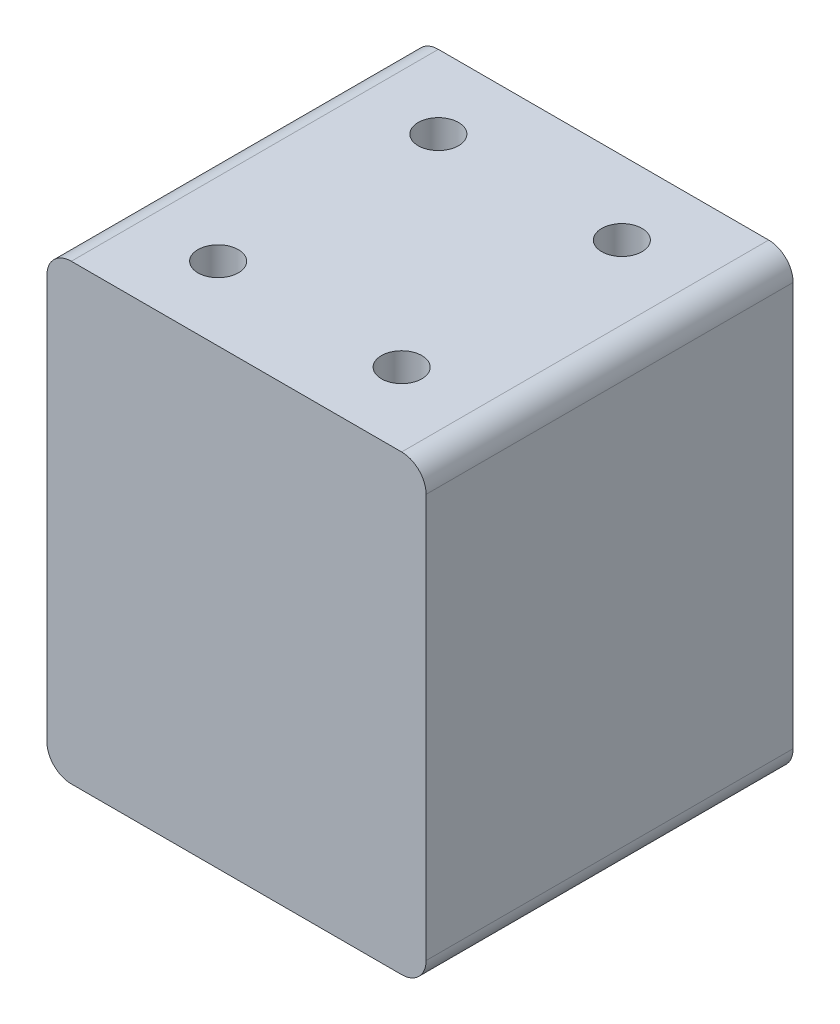
ISO-10303-21;
HEADER;
FILE_DESCRIPTION(('STEP AP214'),'2;1');
FILE_NAME('part.step','',(''),(''),'','','');
FILE_SCHEMA(('AUTOMOTIVE_DESIGN { 1 0 10303 214 1 1 1 1 }'));
ENDSEC;
DATA;
#1=APPLICATION_CONTEXT('core data for automotive mechanical design processes');
#2=APPLICATION_PROTOCOL_DEFINITION('international standard','automotive_design',2000,#1);
#3=PRODUCT_CONTEXT('',#1,'mechanical');
#4=PRODUCT('Part','Part','',(#3));
#5=PRODUCT_RELATED_PRODUCT_CATEGORY('part','',(#4));
#6=PRODUCT_DEFINITION_FORMATION('','',#4);
#7=PRODUCT_DEFINITION_CONTEXT('part definition',#1,'design');
#8=PRODUCT_DEFINITION('design','',#6,#7);
#9=PRODUCT_DEFINITION_SHAPE('','',#8);
#10=(LENGTH_UNIT() NAMED_UNIT(*) SI_UNIT(.MILLI.,.METRE.));
#11=(NAMED_UNIT(*) PLANE_ANGLE_UNIT() SI_UNIT($,.RADIAN.));
#12=(NAMED_UNIT(*) SI_UNIT($,.STERADIAN.) SOLID_ANGLE_UNIT());
#13=UNCERTAINTY_MEASURE_WITH_UNIT(LENGTH_MEASURE(1.E-05),#10,'distance_accuracy_value','');
#14=(GEOMETRIC_REPRESENTATION_CONTEXT(3) GLOBAL_UNCERTAINTY_ASSIGNED_CONTEXT((#13)) GLOBAL_UNIT_ASSIGNED_CONTEXT((#10,
#11,#12)) REPRESENTATION_CONTEXT('',''));
#15=CARTESIAN_POINT('',(0.,0.,0.));
#16=DIRECTION('',(0.,0.,1.));
#17=DIRECTION('',(1.,0.,0.));
#18=AXIS2_PLACEMENT_3D('',#15,#16,#17);
#19=CARTESIAN_POINT('',(15.5,18.5,30.));
#20=DIRECTION('',(-1.,0.,0.));
#21=DIRECTION('',(0.,-1.,0.));
#22=AXIS2_PLACEMENT_3D('',#19,#20,#21);
#23=PLANE('',#22);
#24=DIRECTION('',(0.,1.,0.));
#25=VECTOR('',#24,1.);
#26=CARTESIAN_POINT('',(15.5,18.5,30.));
#27=LINE('',#26,#25);
#28=CARTESIAN_POINT('',(15.5,-16.5,30.));
#29=VERTEX_POINT('',#28);
#30=CARTESIAN_POINT('',(15.5,16.5,30.));
#31=VERTEX_POINT('',#30);
#32=EDGE_CURVE('E231',#29,#31,#27,.T.);
#33=ORIENTED_EDGE('',*,*,#32,.F.);
#34=DIRECTION('',(0.,0.,-1.));
#35=VECTOR('',#34,1.);
#36=CARTESIAN_POINT('',(15.5,-16.5,30.));
#37=LINE('',#36,#35);
#38=CARTESIAN_POINT('',(15.5,-16.5,0.));
#39=VERTEX_POINT('',#38);
#40=EDGE_CURVE('E253',#29,#39,#37,.T.);
#41=ORIENTED_EDGE('',*,*,#40,.T.);
#42=DIRECTION('',(0.,1.,0.));
#43=VECTOR('',#42,1.);
#44=CARTESIAN_POINT('',(15.5,18.5,0.));
#45=LINE('',#44,#43);
#46=CARTESIAN_POINT('',(15.5,16.5,0.));
#47=VERTEX_POINT('',#46);
#48=EDGE_CURVE('E230',#39,#47,#45,.T.);
#49=ORIENTED_EDGE('',*,*,#48,.T.);
#50=DIRECTION('',(0.,0.,-1.));
#51=VECTOR('',#50,1.);
#52=CARTESIAN_POINT('',(15.5,16.5,30.));
#53=LINE('',#52,#51);
#54=EDGE_CURVE('E242',#47,#31,#53,.F.);
#55=ORIENTED_EDGE('',*,*,#54,.T.);
#56=EDGE_LOOP('',(#33,#41,#49,#55));
#57=FACE_BOUND('',#56,.T.);
#58=ADVANCED_FACE('F45',(#57),#23,.F.);
#59=CARTESIAN_POINT('',(-15.5,18.5,30.));
#60=DIRECTION('',(0.,-1.,0.));
#61=DIRECTION('',(0.,0.,-1.));
#62=AXIS2_PLACEMENT_3D('',#59,#60,#61);
#63=PLANE('',#62);
#64=CARTESIAN_POINT('',(-7.50000000000001,18.5,6.));
#65=DIRECTION('',(0.,1.,0.));
#66=DIRECTION('',(0.,0.,1.));
#67=AXIS2_PLACEMENT_3D('',#64,#65,#66);
#68=CIRCLE('',#67,1.65);
#69=CARTESIAN_POINT('',(-7.50000000000001,18.5,7.65));
#70=VERTEX_POINT('',#69);
#71=EDGE_CURVE('E206',#70,#70,#68,.T.);
#72=ORIENTED_EDGE('',*,*,#71,.F.);
#73=EDGE_LOOP('',(#72));
#74=FACE_BOUND('',#73,.T.);
#75=CARTESIAN_POINT('',(7.49999999999999,18.5,6.));
#76=DIRECTION('',(0.,1.,0.));
#77=DIRECTION('',(0.,0.,1.));
#78=AXIS2_PLACEMENT_3D('',#75,#76,#77);
#79=CIRCLE('',#78,1.65);
#80=CARTESIAN_POINT('',(7.49999999999999,18.5,7.65));
#81=VERTEX_POINT('',#80);
#82=EDGE_CURVE('E212',#81,#81,#79,.T.);
#83=ORIENTED_EDGE('',*,*,#82,.F.);
#84=EDGE_LOOP('',(#83));
#85=FACE_BOUND('',#84,.T.);
#86=CARTESIAN_POINT('',(7.5,18.5,24.));
#87=DIRECTION('',(0.,1.,0.));
#88=DIRECTION('',(0.,0.,1.));
#89=AXIS2_PLACEMENT_3D('',#86,#87,#88);
#90=CIRCLE('',#89,1.65);
#91=CARTESIAN_POINT('',(7.5,18.5,25.65));
#92=VERTEX_POINT('',#91);
#93=EDGE_CURVE('E218',#92,#92,#90,.T.);
#94=ORIENTED_EDGE('',*,*,#93,.F.);
#95=EDGE_LOOP('',(#94));
#96=FACE_BOUND('',#95,.T.);
#97=CARTESIAN_POINT('',(-7.5,18.5,24.));
#98=DIRECTION('',(0.,1.,0.));
#99=DIRECTION('',(0.,0.,1.));
#100=AXIS2_PLACEMENT_3D('',#97,#98,#99);
#101=CIRCLE('',#100,1.65);
#102=CARTESIAN_POINT('',(-7.5,18.5,25.65));
#103=VERTEX_POINT('',#102);
#104=EDGE_CURVE('E224',#103,#103,#101,.T.);
#105=ORIENTED_EDGE('',*,*,#104,.F.);
#106=EDGE_LOOP('',(#105));
#107=FACE_BOUND('',#106,.T.);
#108=DIRECTION('',(-1.,0.,0.));
#109=VECTOR('',#108,1.);
#110=CARTESIAN_POINT('',(-15.5,18.5,0.));
#111=LINE('',#110,#109);
#112=CARTESIAN_POINT('',(13.5,18.5,0.));
#113=VERTEX_POINT('',#112);
#114=CARTESIAN_POINT('',(-13.5,18.5,0.));
#115=VERTEX_POINT('',#114);
#116=EDGE_CURVE('E245',#113,#115,#111,.T.);
#117=ORIENTED_EDGE('',*,*,#116,.T.);
#118=DIRECTION('',(0.,0.,-1.));
#119=VECTOR('',#118,1.);
#120=CARTESIAN_POINT('',(-13.5,18.5,30.));
#121=LINE('',#120,#119);
#122=CARTESIAN_POINT('',(-13.5,18.5,30.));
#123=VERTEX_POINT('',#122);
#124=EDGE_CURVE('E283',#115,#123,#121,.F.);
#125=ORIENTED_EDGE('',*,*,#124,.T.);
#126=DIRECTION('',(-1.,0.,0.));
#127=VECTOR('',#126,1.);
#128=CARTESIAN_POINT('',(-15.5,18.5,30.));
#129=LINE('',#128,#127);
#130=CARTESIAN_POINT('',(13.5,18.5,30.));
#131=VERTEX_POINT('',#130);
#132=EDGE_CURVE('E234',#131,#123,#129,.T.);
#133=ORIENTED_EDGE('',*,*,#132,.F.);
#134=DIRECTION('',(0.,0.,-1.));
#135=VECTOR('',#134,1.);
#136=CARTESIAN_POINT('',(13.5,18.5,30.));
#137=LINE('',#136,#135);
#138=EDGE_CURVE('E280',#131,#113,#137,.T.);
#139=ORIENTED_EDGE('',*,*,#138,.T.);
#140=EDGE_LOOP('',(#117,#125,#133,#139));
#141=FACE_BOUND('',#140,.T.);
#142=ADVANCED_FACE('F300',(#74,#85,#96,#107,#141),#63,.F.);
#143=CARTESIAN_POINT('',(-15.5,18.5,30.));
#144=DIRECTION('',(1.,0.,0.));
#145=DIRECTION('',(0.,1.,0.));
#146=AXIS2_PLACEMENT_3D('',#143,#144,#145);
#147=PLANE('',#146);
#148=CARTESIAN_POINT('',(-15.5,12.5,11.));
#149=DIRECTION('',(-1.,0.,0.));
#150=DIRECTION('',(0.,0.,1.));
#151=AXIS2_PLACEMENT_3D('',#148,#149,#150);
#152=CIRCLE('',#151,1.65);
#153=CARTESIAN_POINT('',(-15.5,12.5,12.65));
#154=VERTEX_POINT('',#153);
#155=EDGE_CURVE('E158',#154,#154,#152,.T.);
#156=ORIENTED_EDGE('',*,*,#155,.F.);
#157=EDGE_LOOP('',(#156));
#158=FACE_BOUND('',#157,.T.);
#159=CARTESIAN_POINT('',(-15.5,12.5,19.));
#160=DIRECTION('',(-1.,0.,0.));
#161=DIRECTION('',(0.,0.,1.));
#162=AXIS2_PLACEMENT_3D('',#159,#160,#161);
#163=CIRCLE('',#162,1.65);
#164=CARTESIAN_POINT('',(-15.5,12.5,20.65));
#165=VERTEX_POINT('',#164);
#166=EDGE_CURVE('E157',#165,#165,#163,.T.);
#167=ORIENTED_EDGE('',*,*,#166,.F.);
#168=EDGE_LOOP('',(#167));
#169=FACE_BOUND('',#168,.T.);
#170=CARTESIAN_POINT('',(-15.5,-12.5,19.));
#171=DIRECTION('',(-1.,0.,0.));
#172=DIRECTION('',(0.,0.,1.));
#173=AXIS2_PLACEMENT_3D('',#170,#171,#172);
#174=CIRCLE('',#173,1.65);
#175=CARTESIAN_POINT('',(-15.5,-12.5,20.65));
#176=VERTEX_POINT('',#175);
#177=EDGE_CURVE('E170',#176,#176,#174,.T.);
#178=ORIENTED_EDGE('',*,*,#177,.F.);
#179=EDGE_LOOP('',(#178));
#180=FACE_BOUND('',#179,.T.);
#181=CARTESIAN_POINT('',(-15.5,-12.5,11.));
#182=DIRECTION('',(-1.,0.,0.));
#183=DIRECTION('',(0.,0.,1.));
#184=AXIS2_PLACEMENT_3D('',#181,#182,#183);
#185=CIRCLE('',#184,1.65);
#186=CARTESIAN_POINT('',(-15.5,-12.5,12.65));
#187=VERTEX_POINT('',#186);
#188=EDGE_CURVE('E176',#187,#187,#185,.T.);
#189=ORIENTED_EDGE('',*,*,#188,.F.);
#190=EDGE_LOOP('',(#189));
#191=FACE_BOUND('',#190,.T.);
#192=DIRECTION('',(0.,-1.,0.));
#193=VECTOR('',#192,1.);
#194=CARTESIAN_POINT('',(-15.5,18.5,0.));
#195=LINE('',#194,#193);
#196=CARTESIAN_POINT('',(-15.5,16.5,0.));
#197=VERTEX_POINT('',#196);
#198=CARTESIAN_POINT('',(-15.5,-16.5,0.));
#199=VERTEX_POINT('',#198);
#200=EDGE_CURVE('E248',#197,#199,#195,.T.);
#201=ORIENTED_EDGE('',*,*,#200,.T.);
#202=DIRECTION('',(0.,0.,-1.));
#203=VECTOR('',#202,1.);
#204=CARTESIAN_POINT('',(-15.5,-16.5,30.));
#205=LINE('',#204,#203);
#206=CARTESIAN_POINT('',(-15.5,-16.5,30.));
#207=VERTEX_POINT('',#206);
#208=EDGE_CURVE('E61',#199,#207,#205,.F.);
#209=ORIENTED_EDGE('',*,*,#208,.T.);
#210=DIRECTION('',(0.,-1.,0.));
#211=VECTOR('',#210,1.);
#212=CARTESIAN_POINT('',(-15.5,18.5,30.));
#213=LINE('',#212,#211);
#214=CARTESIAN_POINT('',(-15.5,16.5,30.));
#215=VERTEX_POINT('',#214);
#216=EDGE_CURVE('E237',#215,#207,#213,.T.);
#217=ORIENTED_EDGE('',*,*,#216,.F.);
#218=DIRECTION('',(0.,0.,-1.));
#219=VECTOR('',#218,1.);
#220=CARTESIAN_POINT('',(-15.5,16.5,30.));
#221=LINE('',#220,#219);
#222=EDGE_CURVE('E276',#215,#197,#221,.T.);
#223=ORIENTED_EDGE('',*,*,#222,.T.);
#224=EDGE_LOOP('',(#201,#209,#217,#223));
#225=FACE_BOUND('',#224,.T.);
#226=ADVANCED_FACE('F306',(#158,#169,#180,#191,#225),#147,.F.);
#227=CARTESIAN_POINT('',(-15.5,-18.5,30.));
#228=DIRECTION('',(0.,1.,0.));
#229=DIRECTION('',(0.,0.,1.));
#230=AXIS2_PLACEMENT_3D('',#227,#228,#229);
#231=PLANE('',#230);
#232=CARTESIAN_POINT('',(-7.50000000000001,-18.5,6.));
#233=DIRECTION('',(0.,-1.,0.));
#234=DIRECTION('',(0.,0.,-1.));
#235=AXIS2_PLACEMENT_3D('',#232,#233,#234);
#236=CIRCLE('',#235,1.65);
#237=CARTESIAN_POINT('',(-7.50000000000001,-18.5,4.35));
#238=VERTEX_POINT('',#237);
#239=EDGE_CURVE('E182',#238,#238,#236,.T.);
#240=ORIENTED_EDGE('',*,*,#239,.F.);
#241=EDGE_LOOP('',(#240));
#242=FACE_BOUND('',#241,.T.);
#243=CARTESIAN_POINT('',(7.49999999999999,-18.5,6.));
#244=DIRECTION('',(0.,-1.,0.));
#245=DIRECTION('',(0.,0.,-1.));
#246=AXIS2_PLACEMENT_3D('',#243,#244,#245);
#247=CIRCLE('',#246,1.65);
#248=CARTESIAN_POINT('',(7.49999999999999,-18.5,4.35));
#249=VERTEX_POINT('',#248);
#250=EDGE_CURVE('E188',#249,#249,#247,.T.);
#251=ORIENTED_EDGE('',*,*,#250,.F.);
#252=EDGE_LOOP('',(#251));
#253=FACE_BOUND('',#252,.T.);
#254=CARTESIAN_POINT('',(7.5,-18.5,24.));
#255=DIRECTION('',(0.,-1.,0.));
#256=DIRECTION('',(0.,0.,-1.));
#257=AXIS2_PLACEMENT_3D('',#254,#255,#256);
#258=CIRCLE('',#257,1.65);
#259=CARTESIAN_POINT('',(7.5,-18.5,22.35));
#260=VERTEX_POINT('',#259);
#261=EDGE_CURVE('E194',#260,#260,#258,.T.);
#262=ORIENTED_EDGE('',*,*,#261,.F.);
#263=EDGE_LOOP('',(#262));
#264=FACE_BOUND('',#263,.T.);
#265=CARTESIAN_POINT('',(-7.5,-18.5,24.));
#266=DIRECTION('',(0.,-1.,0.));
#267=DIRECTION('',(0.,0.,-1.));
#268=AXIS2_PLACEMENT_3D('',#265,#266,#267);
#269=CIRCLE('',#268,1.65);
#270=CARTESIAN_POINT('',(-7.5,-18.5,22.35));
#271=VERTEX_POINT('',#270);
#272=EDGE_CURVE('E200',#271,#271,#269,.T.);
#273=ORIENTED_EDGE('',*,*,#272,.F.);
#274=EDGE_LOOP('',(#273));
#275=FACE_BOUND('',#274,.T.);
#276=DIRECTION('',(1.,0.,0.));
#277=VECTOR('',#276,1.);
#278=CARTESIAN_POINT('',(-15.5,-18.5,0.));
#279=LINE('',#278,#277);
#280=CARTESIAN_POINT('',(-13.5,-18.5,0.));
#281=VERTEX_POINT('',#280);
#282=CARTESIAN_POINT('',(13.5,-18.5,0.));
#283=VERTEX_POINT('',#282);
#284=EDGE_CURVE('E235',#281,#283,#279,.T.);
#285=ORIENTED_EDGE('',*,*,#284,.T.);
#286=DIRECTION('',(0.,0.,-1.));
#287=VECTOR('',#286,1.);
#288=CARTESIAN_POINT('',(13.5,-18.5,30.));
#289=LINE('',#288,#287);
#290=CARTESIAN_POINT('',(13.5,-18.5,30.));
#291=VERTEX_POINT('',#290);
#292=EDGE_CURVE('E267',#283,#291,#289,.F.);
#293=ORIENTED_EDGE('',*,*,#292,.T.);
#294=DIRECTION('',(1.,0.,0.));
#295=VECTOR('',#294,1.);
#296=CARTESIAN_POINT('',(-15.5,-18.5,30.));
#297=LINE('',#296,#295);
#298=CARTESIAN_POINT('',(-13.5,-18.5,30.));
#299=VERTEX_POINT('',#298);
#300=EDGE_CURVE('E239',#299,#291,#297,.T.);
#301=ORIENTED_EDGE('',*,*,#300,.F.);
#302=DIRECTION('',(0.,0.,-1.));
#303=VECTOR('',#302,1.);
#304=CARTESIAN_POINT('',(-13.5,-18.5,30.));
#305=LINE('',#304,#303);
#306=EDGE_CURVE('E264',#299,#281,#305,.T.);
#307=ORIENTED_EDGE('',*,*,#306,.T.);
#308=EDGE_LOOP('',(#285,#293,#301,#307));
#309=FACE_BOUND('',#308,.T.);
#310=ADVANCED_FACE('F337',(#242,#253,#264,#275,#309),#231,.F.);
#311=CARTESIAN_POINT('',(0.,0.,30.));
#312=DIRECTION('',(0.,0.,1.));
#313=DIRECTION('',(1.,0.,0.));
#314=AXIS2_PLACEMENT_3D('',#311,#312,#313);
#315=PLANE('',#314);
#316=ORIENTED_EDGE('',*,*,#300,.T.);
#317=CARTESIAN_POINT('',(13.5,-16.5,30.));
#318=DIRECTION('',(0.,0.,1.));
#319=DIRECTION('',(1.,0.,0.));
#320=AXIS2_PLACEMENT_3D('',#317,#318,#319);
#321=CIRCLE('',#320,2.);
#322=EDGE_CURVE('E274',#291,#29,#321,.T.);
#323=ORIENTED_EDGE('',*,*,#322,.T.);
#324=ORIENTED_EDGE('',*,*,#32,.T.);
#325=CARTESIAN_POINT('',(13.5,16.5,30.));
#326=DIRECTION('',(0.,0.,1.));
#327=DIRECTION('',(1.,0.,0.));
#328=AXIS2_PLACEMENT_3D('',#325,#326,#327);
#329=CIRCLE('',#328,2.);
#330=EDGE_CURVE('E269',#31,#131,#329,.T.);
#331=ORIENTED_EDGE('',*,*,#330,.T.);
#332=ORIENTED_EDGE('',*,*,#132,.T.);
#333=CARTESIAN_POINT('',(-13.5,16.5,30.));
#334=DIRECTION('',(0.,0.,1.));
#335=DIRECTION('',(1.,0.,0.));
#336=AXIS2_PLACEMENT_3D('',#333,#334,#335);
#337=CIRCLE('',#336,2.);
#338=EDGE_CURVE('E68',#123,#215,#337,.T.);
#339=ORIENTED_EDGE('',*,*,#338,.T.);
#340=ORIENTED_EDGE('',*,*,#216,.T.);
#341=CARTESIAN_POINT('',(-13.5,-16.5,30.));
#342=DIRECTION('',(0.,0.,1.));
#343=DIRECTION('',(1.,0.,0.));
#344=AXIS2_PLACEMENT_3D('',#341,#342,#343);
#345=CIRCLE('',#344,2.);
#346=EDGE_CURVE('E272',#207,#299,#345,.T.);
#347=ORIENTED_EDGE('',*,*,#346,.T.);
#348=EDGE_LOOP('',(#316,#323,#324,#331,#332,#339,#340,#347));
#349=FACE_BOUND('',#348,.T.);
#350=ADVANCED_FACE('F340',(#349),#315,.T.);
#351=CARTESIAN_POINT('',(0.,0.,0.));
#352=DIRECTION('',(0.,0.,1.));
#353=DIRECTION('',(1.,0.,0.));
#354=AXIS2_PLACEMENT_3D('',#351,#352,#353);
#355=PLANE('',#354);
#356=CARTESIAN_POINT('',(0.,0.,0.));
#357=DIRECTION('',(0.,0.,1.));
#358=DIRECTION('',(1.,0.,0.));
#359=AXIS2_PLACEMENT_3D('',#356,#357,#358);
#360=CIRCLE('',#359,10.5);
#361=CARTESIAN_POINT('',(10.5,0.,0.));
#362=VERTEX_POINT('',#361);
#363=EDGE_CURVE('E11',#362,#362,#360,.T.);
#364=ORIENTED_EDGE('',*,*,#363,.T.);
#365=EDGE_LOOP('',(#364));
#366=FACE_BOUND('',#365,.T.);
#367=ORIENTED_EDGE('',*,*,#48,.F.);
#368=CARTESIAN_POINT('',(13.5,-16.5,0.));
#369=DIRECTION('',(0.,0.,1.));
#370=DIRECTION('',(1.,0.,0.));
#371=AXIS2_PLACEMENT_3D('',#368,#369,#370);
#372=CIRCLE('',#371,2.);
#373=EDGE_CURVE('E262',#39,#283,#372,.F.);
#374=ORIENTED_EDGE('',*,*,#373,.T.);
#375=ORIENTED_EDGE('',*,*,#284,.F.);
#376=CARTESIAN_POINT('',(-13.5,-16.5,0.));
#377=DIRECTION('',(0.,0.,1.));
#378=DIRECTION('',(1.,0.,0.));
#379=AXIS2_PLACEMENT_3D('',#376,#377,#378);
#380=CIRCLE('',#379,2.);
#381=EDGE_CURVE('E260',#281,#199,#380,.F.);
#382=ORIENTED_EDGE('',*,*,#381,.T.);
#383=ORIENTED_EDGE('',*,*,#200,.F.);
#384=CARTESIAN_POINT('',(-13.5,16.5,0.));
#385=DIRECTION('',(0.,0.,1.));
#386=DIRECTION('',(1.,0.,0.));
#387=AXIS2_PLACEMENT_3D('',#384,#385,#386);
#388=CIRCLE('',#387,2.);
#389=EDGE_CURVE('E258',#197,#115,#388,.F.);
#390=ORIENTED_EDGE('',*,*,#389,.T.);
#391=ORIENTED_EDGE('',*,*,#116,.F.);
#392=CARTESIAN_POINT('',(13.5,16.5,0.));
#393=DIRECTION('',(0.,0.,1.));
#394=DIRECTION('',(1.,0.,0.));
#395=AXIS2_PLACEMENT_3D('',#392,#393,#394);
#396=CIRCLE('',#395,2.);
#397=EDGE_CURVE('E256',#113,#47,#396,.F.);
#398=ORIENTED_EDGE('',*,*,#397,.T.);
#399=EDGE_LOOP('',(#367,#374,#375,#382,#383,#390,#391,#398));
#400=FACE_BOUND('',#399,.T.);
#401=ADVANCED_FACE('F330',(#366,#400),#355,.F.);
#402=CARTESIAN_POINT('',(-7.5,9.5,24.));
#403=DIRECTION('',(0.,1.,0.));
#404=DIRECTION('',(0.,0.,1.));
#405=AXIS2_PLACEMENT_3D('',#402,#403,#404);
#406=CONICAL_SURFACE('',#405,1.65,1.02974425867665);
#407=CARTESIAN_POINT('',(-7.50000000000001,8.50857997860452,24.));
#408=VERTEX_POINT('',#407);
#409=VERTEX_LOOP('',#408);
#410=FACE_BOUND('',#409,.T.);
#411=CARTESIAN_POINT('',(-7.5,9.5,24.));
#412=DIRECTION('',(0.,1.,0.));
#413=DIRECTION('',(0.,0.,1.));
#414=AXIS2_PLACEMENT_3D('',#411,#412,#413);
#415=CIRCLE('',#414,1.65);
#416=CARTESIAN_POINT('',(-7.5,9.5,25.65));
#417=VERTEX_POINT('',#416);
#418=EDGE_CURVE('E227',#417,#417,#415,.T.);
#419=ORIENTED_EDGE('',*,*,#418,.T.);
#420=EDGE_LOOP('',(#419));
#421=FACE_BOUND('',#420,.T.);
#422=ADVANCED_FACE('F353',(#410,#421),#406,.F.);
#423=CARTESIAN_POINT('',(-7.5,18.5,24.));
#424=DIRECTION('',(0.,1.,0.));
#425=DIRECTION('',(0.,0.,1.));
#426=AXIS2_PLACEMENT_3D('',#423,#424,#425);
#427=CYLINDRICAL_SURFACE('',#426,1.65);
#428=ORIENTED_EDGE('',*,*,#418,.F.);
#429=EDGE_LOOP('',(#428));
#430=FACE_BOUND('',#429,.T.);
#431=ORIENTED_EDGE('',*,*,#104,.T.);
#432=EDGE_LOOP('',(#431));
#433=FACE_BOUND('',#432,.T.);
#434=ADVANCED_FACE('F444',(#430,#433),#427,.F.);
#435=CARTESIAN_POINT('',(7.5,9.5,24.));
#436=DIRECTION('',(0.,1.,0.));
#437=DIRECTION('',(0.,0.,1.));
#438=AXIS2_PLACEMENT_3D('',#435,#436,#437);
#439=CONICAL_SURFACE('',#438,1.65,1.02974425867665);
#440=CARTESIAN_POINT('',(7.49999999999999,8.50857997860452,24.));
#441=VERTEX_POINT('',#440);
#442=VERTEX_LOOP('',#441);
#443=FACE_BOUND('',#442,.T.);
#444=CARTESIAN_POINT('',(7.5,9.5,24.));
#445=DIRECTION('',(0.,1.,0.));
#446=DIRECTION('',(0.,0.,1.));
#447=AXIS2_PLACEMENT_3D('',#444,#445,#446);
#448=CIRCLE('',#447,1.65);
#449=CARTESIAN_POINT('',(7.5,9.5,25.65));
#450=VERTEX_POINT('',#449);
#451=EDGE_CURVE('E221',#450,#450,#448,.T.);
#452=ORIENTED_EDGE('',*,*,#451,.T.);
#453=EDGE_LOOP('',(#452));
#454=FACE_BOUND('',#453,.T.);
#455=ADVANCED_FACE('F441',(#443,#454),#439,.F.);
#456=CARTESIAN_POINT('',(7.5,18.5,24.));
#457=DIRECTION('',(0.,1.,0.));
#458=DIRECTION('',(0.,0.,1.));
#459=AXIS2_PLACEMENT_3D('',#456,#457,#458);
#460=CYLINDRICAL_SURFACE('',#459,1.65);
#461=ORIENTED_EDGE('',*,*,#451,.F.);
#462=EDGE_LOOP('',(#461));
#463=FACE_BOUND('',#462,.T.);
#464=ORIENTED_EDGE('',*,*,#93,.T.);
#465=EDGE_LOOP('',(#464));
#466=FACE_BOUND('',#465,.T.);
#467=ADVANCED_FACE('F437',(#463,#466),#460,.F.);
#468=CARTESIAN_POINT('',(7.49999999999999,9.5,6.));
#469=DIRECTION('',(0.,1.,0.));
#470=DIRECTION('',(0.,0.,1.));
#471=AXIS2_PLACEMENT_3D('',#468,#469,#470);
#472=CONICAL_SURFACE('',#471,1.65,1.02974425867665);
#473=CARTESIAN_POINT('',(7.49999999999999,8.50857997860452,6.));
#474=VERTEX_POINT('',#473);
#475=VERTEX_LOOP('',#474);
#476=FACE_BOUND('',#475,.T.);
#477=CARTESIAN_POINT('',(7.49999999999999,9.5,6.));
#478=DIRECTION('',(0.,1.,0.));
#479=DIRECTION('',(0.,0.,1.));
#480=AXIS2_PLACEMENT_3D('',#477,#478,#479);
#481=CIRCLE('',#480,1.65);
#482=CARTESIAN_POINT('',(7.49999999999999,9.5,7.65));
#483=VERTEX_POINT('',#482);
#484=EDGE_CURVE('E215',#483,#483,#481,.T.);
#485=ORIENTED_EDGE('',*,*,#484,.T.);
#486=EDGE_LOOP('',(#485));
#487=FACE_BOUND('',#486,.T.);
#488=ADVANCED_FACE('F433',(#476,#487),#472,.F.);
#489=CARTESIAN_POINT('',(7.49999999999999,18.5,6.));
#490=DIRECTION('',(0.,1.,0.));
#491=DIRECTION('',(0.,0.,1.));
#492=AXIS2_PLACEMENT_3D('',#489,#490,#491);
#493=CYLINDRICAL_SURFACE('',#492,1.65);
#494=ORIENTED_EDGE('',*,*,#484,.F.);
#495=EDGE_LOOP('',(#494));
#496=FACE_BOUND('',#495,.T.);
#497=ORIENTED_EDGE('',*,*,#82,.T.);
#498=EDGE_LOOP('',(#497));
#499=FACE_BOUND('',#498,.T.);
#500=ADVANCED_FACE('F429',(#496,#499),#493,.F.);
#501=CARTESIAN_POINT('',(-7.50000000000001,9.5,6.));
#502=DIRECTION('',(0.,1.,0.));
#503=DIRECTION('',(0.,0.,1.));
#504=AXIS2_PLACEMENT_3D('',#501,#502,#503);
#505=CONICAL_SURFACE('',#504,1.65,1.02974425867665);
#506=CARTESIAN_POINT('',(-7.50000000000001,8.50857997860452,6.));
#507=VERTEX_POINT('',#506);
#508=VERTEX_LOOP('',#507);
#509=FACE_BOUND('',#508,.T.);
#510=CARTESIAN_POINT('',(-7.50000000000001,9.5,6.));
#511=DIRECTION('',(0.,1.,0.));
#512=DIRECTION('',(0.,0.,1.));
#513=AXIS2_PLACEMENT_3D('',#510,#511,#512);
#514=CIRCLE('',#513,1.65);
#515=CARTESIAN_POINT('',(-7.50000000000001,9.5,7.65));
#516=VERTEX_POINT('',#515);
#517=EDGE_CURVE('E209',#516,#516,#514,.T.);
#518=ORIENTED_EDGE('',*,*,#517,.T.);
#519=EDGE_LOOP('',(#518));
#520=FACE_BOUND('',#519,.T.);
#521=ADVANCED_FACE('F425',(#509,#520),#505,.F.);
#522=CARTESIAN_POINT('',(-7.50000000000001,18.5,6.));
#523=DIRECTION('',(0.,1.,0.));
#524=DIRECTION('',(0.,0.,1.));
#525=AXIS2_PLACEMENT_3D('',#522,#523,#524);
#526=CYLINDRICAL_SURFACE('',#525,1.65);
#527=ORIENTED_EDGE('',*,*,#517,.F.);
#528=EDGE_LOOP('',(#527));
#529=FACE_BOUND('',#528,.T.);
#530=ORIENTED_EDGE('',*,*,#71,.T.);
#531=EDGE_LOOP('',(#530));
#532=FACE_BOUND('',#531,.T.);
#533=ADVANCED_FACE('F421',(#529,#532),#526,.F.);
#534=CARTESIAN_POINT('',(-7.5,-9.5,24.));
#535=DIRECTION('',(0.,-1.,0.));
#536=DIRECTION('',(0.,0.,-1.));
#537=AXIS2_PLACEMENT_3D('',#534,#535,#536);
#538=CONICAL_SURFACE('',#537,1.65,1.02974425867665);
#539=CARTESIAN_POINT('',(-7.50000000000001,-8.50857997860452,24.));
#540=VERTEX_POINT('',#539);
#541=VERTEX_LOOP('',#540);
#542=FACE_BOUND('',#541,.T.);
#543=CARTESIAN_POINT('',(-7.5,-9.5,24.));
#544=DIRECTION('',(0.,-1.,0.));
#545=DIRECTION('',(0.,0.,-1.));
#546=AXIS2_PLACEMENT_3D('',#543,#544,#545);
#547=CIRCLE('',#546,1.65);
#548=CARTESIAN_POINT('',(-7.5,-9.5,22.35));
#549=VERTEX_POINT('',#548);
#550=EDGE_CURVE('E203',#549,#549,#547,.T.);
#551=ORIENTED_EDGE('',*,*,#550,.T.);
#552=EDGE_LOOP('',(#551));
#553=FACE_BOUND('',#552,.T.);
#554=ADVANCED_FACE('F417',(#542,#553),#538,.F.);
#555=CARTESIAN_POINT('',(-7.5,-18.5,24.));
#556=DIRECTION('',(0.,-1.,0.));
#557=DIRECTION('',(0.,0.,-1.));
#558=AXIS2_PLACEMENT_3D('',#555,#556,#557);
#559=CYLINDRICAL_SURFACE('',#558,1.65);
#560=ORIENTED_EDGE('',*,*,#550,.F.);
#561=EDGE_LOOP('',(#560));
#562=FACE_BOUND('',#561,.T.);
#563=ORIENTED_EDGE('',*,*,#272,.T.);
#564=EDGE_LOOP('',(#563));
#565=FACE_BOUND('',#564,.T.);
#566=ADVANCED_FACE('F413',(#562,#565),#559,.F.);
#567=CARTESIAN_POINT('',(7.5,-9.5,24.));
#568=DIRECTION('',(0.,-1.,0.));
#569=DIRECTION('',(0.,0.,-1.));
#570=AXIS2_PLACEMENT_3D('',#567,#568,#569);
#571=CONICAL_SURFACE('',#570,1.65,1.02974425867665);
#572=CARTESIAN_POINT('',(7.49999999999999,-8.50857997860452,24.));
#573=VERTEX_POINT('',#572);
#574=VERTEX_LOOP('',#573);
#575=FACE_BOUND('',#574,.T.);
#576=CARTESIAN_POINT('',(7.5,-9.5,24.));
#577=DIRECTION('',(0.,-1.,0.));
#578=DIRECTION('',(0.,0.,-1.));
#579=AXIS2_PLACEMENT_3D('',#576,#577,#578);
#580=CIRCLE('',#579,1.65);
#581=CARTESIAN_POINT('',(7.5,-9.5,22.35));
#582=VERTEX_POINT('',#581);
#583=EDGE_CURVE('E197',#582,#582,#580,.T.);
#584=ORIENTED_EDGE('',*,*,#583,.T.);
#585=EDGE_LOOP('',(#584));
#586=FACE_BOUND('',#585,.T.);
#587=ADVANCED_FACE('F409',(#575,#586),#571,.F.);
#588=CARTESIAN_POINT('',(7.5,-18.5,24.));
#589=DIRECTION('',(0.,-1.,0.));
#590=DIRECTION('',(0.,0.,-1.));
#591=AXIS2_PLACEMENT_3D('',#588,#589,#590);
#592=CYLINDRICAL_SURFACE('',#591,1.65);
#593=ORIENTED_EDGE('',*,*,#583,.F.);
#594=EDGE_LOOP('',(#593));
#595=FACE_BOUND('',#594,.T.);
#596=ORIENTED_EDGE('',*,*,#261,.T.);
#597=EDGE_LOOP('',(#596));
#598=FACE_BOUND('',#597,.T.);
#599=ADVANCED_FACE('F405',(#595,#598),#592,.F.);
#600=CARTESIAN_POINT('',(7.49999999999999,-9.5,6.));
#601=DIRECTION('',(0.,-1.,0.));
#602=DIRECTION('',(0.,0.,-1.));
#603=AXIS2_PLACEMENT_3D('',#600,#601,#602);
#604=CONICAL_SURFACE('',#603,1.65,1.02974425867665);
#605=CARTESIAN_POINT('',(7.49999999999999,-8.50857997860452,6.));
#606=VERTEX_POINT('',#605);
#607=VERTEX_LOOP('',#606);
#608=FACE_BOUND('',#607,.T.);
#609=CARTESIAN_POINT('',(7.49999999999999,-9.5,6.));
#610=DIRECTION('',(0.,-1.,0.));
#611=DIRECTION('',(0.,0.,-1.));
#612=AXIS2_PLACEMENT_3D('',#609,#610,#611);
#613=CIRCLE('',#612,1.65);
#614=CARTESIAN_POINT('',(7.49999999999999,-9.5,4.35));
#615=VERTEX_POINT('',#614);
#616=EDGE_CURVE('E191',#615,#615,#613,.T.);
#617=ORIENTED_EDGE('',*,*,#616,.T.);
#618=EDGE_LOOP('',(#617));
#619=FACE_BOUND('',#618,.T.);
#620=ADVANCED_FACE('F401',(#608,#619),#604,.F.);
#621=CARTESIAN_POINT('',(7.49999999999999,-18.5,6.));
#622=DIRECTION('',(0.,-1.,0.));
#623=DIRECTION('',(0.,0.,-1.));
#624=AXIS2_PLACEMENT_3D('',#621,#622,#623);
#625=CYLINDRICAL_SURFACE('',#624,1.65);
#626=ORIENTED_EDGE('',*,*,#616,.F.);
#627=EDGE_LOOP('',(#626));
#628=FACE_BOUND('',#627,.T.);
#629=ORIENTED_EDGE('',*,*,#250,.T.);
#630=EDGE_LOOP('',(#629));
#631=FACE_BOUND('',#630,.T.);
#632=ADVANCED_FACE('F397',(#628,#631),#625,.F.);
#633=CARTESIAN_POINT('',(-7.50000000000001,-9.5,6.));
#634=DIRECTION('',(0.,-1.,0.));
#635=DIRECTION('',(0.,0.,-1.));
#636=AXIS2_PLACEMENT_3D('',#633,#634,#635);
#637=CONICAL_SURFACE('',#636,1.65,1.02974425867665);
#638=CARTESIAN_POINT('',(-7.50000000000001,-8.50857997860452,6.));
#639=VERTEX_POINT('',#638);
#640=VERTEX_LOOP('',#639);
#641=FACE_BOUND('',#640,.T.);
#642=CARTESIAN_POINT('',(-7.50000000000001,-9.5,6.));
#643=DIRECTION('',(0.,-1.,0.));
#644=DIRECTION('',(0.,0.,-1.));
#645=AXIS2_PLACEMENT_3D('',#642,#643,#644);
#646=CIRCLE('',#645,1.65);
#647=CARTESIAN_POINT('',(-7.50000000000001,-9.5,4.35));
#648=VERTEX_POINT('',#647);
#649=EDGE_CURVE('E185',#648,#648,#646,.T.);
#650=ORIENTED_EDGE('',*,*,#649,.T.);
#651=EDGE_LOOP('',(#650));
#652=FACE_BOUND('',#651,.T.);
#653=ADVANCED_FACE('F393',(#641,#652),#637,.F.);
#654=CARTESIAN_POINT('',(-7.50000000000001,-18.5,6.));
#655=DIRECTION('',(0.,-1.,0.));
#656=DIRECTION('',(0.,0.,-1.));
#657=AXIS2_PLACEMENT_3D('',#654,#655,#656);
#658=CYLINDRICAL_SURFACE('',#657,1.65);
#659=ORIENTED_EDGE('',*,*,#649,.F.);
#660=EDGE_LOOP('',(#659));
#661=FACE_BOUND('',#660,.T.);
#662=ORIENTED_EDGE('',*,*,#239,.T.);
#663=EDGE_LOOP('',(#662));
#664=FACE_BOUND('',#663,.T.);
#665=ADVANCED_FACE('F385',(#661,#664),#658,.F.);
#666=CARTESIAN_POINT('',(-5.5,-12.5,11.));
#667=DIRECTION('',(-1.,0.,0.));
#668=DIRECTION('',(0.,0.,1.));
#669=AXIS2_PLACEMENT_3D('',#666,#667,#668);
#670=CONICAL_SURFACE('',#669,1.65,1.02974425867665);
#671=CARTESIAN_POINT('',(-4.50857997860453,-12.5,11.));
#672=VERTEX_POINT('',#671);
#673=VERTEX_LOOP('',#672);
#674=FACE_BOUND('',#673,.T.);
#675=CARTESIAN_POINT('',(-5.5,-12.5,11.));
#676=DIRECTION('',(-1.,0.,0.));
#677=DIRECTION('',(0.,0.,1.));
#678=AXIS2_PLACEMENT_3D('',#675,#676,#677);
#679=CIRCLE('',#678,1.65);
#680=CARTESIAN_POINT('',(-5.5,-12.5,12.65));
#681=VERTEX_POINT('',#680);
#682=EDGE_CURVE('E179',#681,#681,#679,.T.);
#683=ORIENTED_EDGE('',*,*,#682,.T.);
#684=EDGE_LOOP('',(#683));
#685=FACE_BOUND('',#684,.T.);
#686=ADVANCED_FACE('F375',(#674,#685),#670,.F.);
#687=CARTESIAN_POINT('',(-15.5,-12.5,11.));
#688=DIRECTION('',(-1.,0.,0.));
#689=DIRECTION('',(0.,0.,1.));
#690=AXIS2_PLACEMENT_3D('',#687,#688,#689);
#691=CYLINDRICAL_SURFACE('',#690,1.65);
#692=ORIENTED_EDGE('',*,*,#682,.F.);
#693=EDGE_LOOP('',(#692));
#694=FACE_BOUND('',#693,.T.);
#695=ORIENTED_EDGE('',*,*,#188,.T.);
#696=EDGE_LOOP('',(#695));
#697=FACE_BOUND('',#696,.T.);
#698=ADVANCED_FACE('F372',(#694,#697),#691,.F.);
#699=CARTESIAN_POINT('',(-5.5,-12.5,19.));
#700=DIRECTION('',(-1.,0.,0.));
#701=DIRECTION('',(0.,0.,1.));
#702=AXIS2_PLACEMENT_3D('',#699,#700,#701);
#703=CONICAL_SURFACE('',#702,1.65,1.02974425867665);
#704=CARTESIAN_POINT('',(-4.50857997860453,-12.5,19.));
#705=VERTEX_POINT('',#704);
#706=VERTEX_LOOP('',#705);
#707=FACE_BOUND('',#706,.T.);
#708=CARTESIAN_POINT('',(-5.5,-12.5,19.));
#709=DIRECTION('',(-1.,0.,0.));
#710=DIRECTION('',(0.,0.,1.));
#711=AXIS2_PLACEMENT_3D('',#708,#709,#710);
#712=CIRCLE('',#711,1.65);
#713=CARTESIAN_POINT('',(-5.5,-12.5,20.65));
#714=VERTEX_POINT('',#713);
#715=EDGE_CURVE('E173',#714,#714,#712,.T.);
#716=ORIENTED_EDGE('',*,*,#715,.T.);
#717=EDGE_LOOP('',(#716));
#718=FACE_BOUND('',#717,.T.);
#719=ADVANCED_FACE('F374',(#707,#718),#703,.F.);
#720=CARTESIAN_POINT('',(-15.5,-12.5,19.));
#721=DIRECTION('',(-1.,0.,0.));
#722=DIRECTION('',(0.,0.,1.));
#723=AXIS2_PLACEMENT_3D('',#720,#721,#722);
#724=CYLINDRICAL_SURFACE('',#723,1.65);
#725=ORIENTED_EDGE('',*,*,#715,.F.);
#726=EDGE_LOOP('',(#725));
#727=FACE_BOUND('',#726,.T.);
#728=ORIENTED_EDGE('',*,*,#177,.T.);
#729=EDGE_LOOP('',(#728));
#730=FACE_BOUND('',#729,.T.);
#731=ADVANCED_FACE('F382',(#727,#730),#724,.F.);
#732=CARTESIAN_POINT('',(-5.50000000000001,12.5,19.));
#733=DIRECTION('',(-1.,0.,0.));
#734=DIRECTION('',(0.,0.,1.));
#735=AXIS2_PLACEMENT_3D('',#732,#733,#734);
#736=CONICAL_SURFACE('',#735,1.65,1.02974425867665);
#737=CARTESIAN_POINT('',(-4.50857997860453,12.5,19.));
#738=VERTEX_POINT('',#737);
#739=VERTEX_LOOP('',#738);
#740=FACE_BOUND('',#739,.T.);
#741=CARTESIAN_POINT('',(-5.50000000000001,12.5,19.));
#742=DIRECTION('',(-1.,0.,0.));
#743=DIRECTION('',(0.,0.,1.));
#744=AXIS2_PLACEMENT_3D('',#741,#742,#743);
#745=CIRCLE('',#744,1.65);
#746=CARTESIAN_POINT('',(-5.50000000000001,12.5,20.65));
#747=VERTEX_POINT('',#746);
#748=EDGE_CURVE('E161',#747,#747,#745,.T.);
#749=ORIENTED_EDGE('',*,*,#748,.T.);
#750=EDGE_LOOP('',(#749));
#751=FACE_BOUND('',#750,.T.);
#752=ADVANCED_FACE('F549',(#740,#751),#736,.F.);
#753=CARTESIAN_POINT('',(-15.5,12.5,19.));
#754=DIRECTION('',(-1.,0.,0.));
#755=DIRECTION('',(0.,0.,1.));
#756=AXIS2_PLACEMENT_3D('',#753,#754,#755);
#757=CYLINDRICAL_SURFACE('',#756,1.65);
#758=ORIENTED_EDGE('',*,*,#748,.F.);
#759=EDGE_LOOP('',(#758));
#760=FACE_BOUND('',#759,.T.);
#761=ORIENTED_EDGE('',*,*,#166,.T.);
#762=EDGE_LOOP('',(#761));
#763=FACE_BOUND('',#762,.T.);
#764=ADVANCED_FACE('F151',(#760,#763),#757,.F.);
#765=CARTESIAN_POINT('',(-5.50000000000001,12.5,11.));
#766=DIRECTION('',(-1.,0.,0.));
#767=DIRECTION('',(0.,0.,1.));
#768=AXIS2_PLACEMENT_3D('',#765,#766,#767);
#769=CONICAL_SURFACE('',#768,1.65,1.02974425867665);
#770=CARTESIAN_POINT('',(-4.50857997860453,12.5,11.));
#771=VERTEX_POINT('',#770);
#772=VERTEX_LOOP('',#771);
#773=FACE_BOUND('',#772,.T.);
#774=CARTESIAN_POINT('',(-5.50000000000001,12.5,11.));
#775=DIRECTION('',(-1.,0.,0.));
#776=DIRECTION('',(0.,0.,1.));
#777=AXIS2_PLACEMENT_3D('',#774,#775,#776);
#778=CIRCLE('',#777,1.65);
#779=CARTESIAN_POINT('',(-5.50000000000001,12.5,12.65));
#780=VERTEX_POINT('',#779);
#781=EDGE_CURVE('E155',#780,#780,#778,.T.);
#782=ORIENTED_EDGE('',*,*,#781,.T.);
#783=EDGE_LOOP('',(#782));
#784=FACE_BOUND('',#783,.T.);
#785=ADVANCED_FACE('F147',(#773,#784),#769,.F.);
#786=CARTESIAN_POINT('',(-15.5,12.5,11.));
#787=DIRECTION('',(-1.,0.,0.));
#788=DIRECTION('',(0.,0.,1.));
#789=AXIS2_PLACEMENT_3D('',#786,#787,#788);
#790=CYLINDRICAL_SURFACE('',#789,1.65);
#791=ORIENTED_EDGE('',*,*,#781,.F.);
#792=EDGE_LOOP('',(#791));
#793=FACE_BOUND('',#792,.T.);
#794=ORIENTED_EDGE('',*,*,#155,.T.);
#795=EDGE_LOOP('',(#794));
#796=FACE_BOUND('',#795,.T.);
#797=ADVANCED_FACE('F150',(#793,#796),#790,.F.);
#798=CARTESIAN_POINT('',(0.,0.,9.7));
#799=DIRECTION('',(0.,0.,-1.));
#800=DIRECTION('',(-1.,0.,0.));
#801=AXIS2_PLACEMENT_3D('',#798,#799,#800);
#802=CYLINDRICAL_SURFACE('',#801,9.5);
#803=CARTESIAN_POINT('',(0.,0.,1.00000000000001));
#804=DIRECTION('',(0.,0.,1.));
#805=DIRECTION('',(1.,0.,0.));
#806=AXIS2_PLACEMENT_3D('',#803,#804,#805);
#807=CIRCLE('',#806,9.5);
#808=CARTESIAN_POINT('',(9.5,0.,1.00000000000001));
#809=VERTEX_POINT('',#808);
#810=EDGE_CURVE('E54',#809,#809,#807,.F.);
#811=ORIENTED_EDGE('',*,*,#810,.T.);
#812=EDGE_LOOP('',(#811));
#813=FACE_BOUND('',#812,.T.);
#814=CARTESIAN_POINT('',(0.,0.,9.7));
#815=DIRECTION('',(0.,0.,-1.));
#816=DIRECTION('',(-1.,0.,0.));
#817=AXIS2_PLACEMENT_3D('',#814,#815,#816);
#818=CIRCLE('',#817,9.5);
#819=CARTESIAN_POINT('',(-9.5,0.,9.7));
#820=VERTEX_POINT('',#819);
#821=EDGE_CURVE('E164',#820,#820,#818,.T.);
#822=ORIENTED_EDGE('',*,*,#821,.F.);
#823=EDGE_LOOP('',(#822));
#824=FACE_BOUND('',#823,.T.);
#825=ADVANCED_FACE('F287',(#813,#824),#802,.F.);
#826=CARTESIAN_POINT('',(0.,0.,9.7));
#827=DIRECTION('',(0.,0.,-1.));
#828=DIRECTION('',(-1.,0.,0.));
#829=AXIS2_PLACEMENT_3D('',#826,#827,#828);
#830=PLANE('',#829);
#831=CARTESIAN_POINT('',(0.,0.,9.7));
#832=DIRECTION('',(0.,0.,-1.));
#833=DIRECTION('',(-1.,0.,0.));
#834=AXIS2_PLACEMENT_3D('',#831,#832,#833);
#835=CIRCLE('',#834,8.65);
#836=CARTESIAN_POINT('',(-8.65,0.,9.7));
#837=VERTEX_POINT('',#836);
#838=EDGE_CURVE('E846',#837,#837,#835,.T.);
#839=ORIENTED_EDGE('',*,*,#838,.F.);
#840=EDGE_LOOP('',(#839));
#841=FACE_BOUND('',#840,.T.);
#842=ORIENTED_EDGE('',*,*,#821,.T.);
#843=EDGE_LOOP('',(#842));
#844=FACE_BOUND('',#843,.T.);
#845=ADVANCED_FACE('F476',(#841,#844),#830,.T.);
#846=CARTESIAN_POINT('',(0.,0.,13.));
#847=DIRECTION('',(0.,0.,-1.));
#848=DIRECTION('',(-1.,0.,0.));
#849=AXIS2_PLACEMENT_3D('',#846,#847,#848);
#850=CYLINDRICAL_SURFACE('',#849,8.65);
#851=CARTESIAN_POINT('',(0.,0.,13.));
#852=DIRECTION('',(0.,0.,-1.));
#853=DIRECTION('',(-1.,0.,0.));
#854=AXIS2_PLACEMENT_3D('',#851,#852,#853);
#855=CIRCLE('',#854,8.65);
#856=CARTESIAN_POINT('',(-8.65,0.,13.));
#857=VERTEX_POINT('',#856);
#858=EDGE_CURVE('E849',#857,#857,#855,.T.);
#859=ORIENTED_EDGE('',*,*,#858,.F.);
#860=EDGE_LOOP('',(#859));
#861=FACE_BOUND('',#860,.T.);
#862=ORIENTED_EDGE('',*,*,#838,.T.);
#863=EDGE_LOOP('',(#862));
#864=FACE_BOUND('',#863,.T.);
#865=ADVANCED_FACE('F511',(#861,#864),#850,.F.);
#866=CARTESIAN_POINT('',(0.,0.,13.));
#867=DIRECTION('',(0.,0.,-1.));
#868=DIRECTION('',(-1.,0.,0.));
#869=AXIS2_PLACEMENT_3D('',#866,#867,#868);
#870=PLANE('',#869);
#871=ORIENTED_EDGE('',*,*,#858,.T.);
#872=EDGE_LOOP('',(#871));
#873=FACE_BOUND('',#872,.T.);
#874=ADVANCED_FACE('F316',(#873),#870,.T.);
#875=CARTESIAN_POINT('',(13.5,-16.5,30.));
#876=DIRECTION('',(0.,0.,-1.));
#877=DIRECTION('',(-1.,0.,0.));
#878=AXIS2_PLACEMENT_3D('',#875,#876,#877);
#879=CYLINDRICAL_SURFACE('',#878,2.);
#880=ORIENTED_EDGE('',*,*,#322,.F.);
#881=ORIENTED_EDGE('',*,*,#292,.F.);
#882=ORIENTED_EDGE('',*,*,#373,.F.);
#883=ORIENTED_EDGE('',*,*,#40,.F.);
#884=EDGE_LOOP('',(#880,#881,#882,#883));
#885=FACE_BOUND('',#884,.T.);
#886=ADVANCED_FACE('F312',(#885),#879,.T.);
#887=CARTESIAN_POINT('',(-13.5,-16.5,30.));
#888=DIRECTION('',(0.,0.,-1.));
#889=DIRECTION('',(-1.,0.,0.));
#890=AXIS2_PLACEMENT_3D('',#887,#888,#889);
#891=CYLINDRICAL_SURFACE('',#890,2.);
#892=ORIENTED_EDGE('',*,*,#346,.F.);
#893=ORIENTED_EDGE('',*,*,#208,.F.);
#894=ORIENTED_EDGE('',*,*,#381,.F.);
#895=ORIENTED_EDGE('',*,*,#306,.F.);
#896=EDGE_LOOP('',(#892,#893,#894,#895));
#897=FACE_BOUND('',#896,.T.);
#898=ADVANCED_FACE('F315',(#897),#891,.T.);
#899=CARTESIAN_POINT('',(-13.5,16.5,30.));
#900=DIRECTION('',(0.,0.,-1.));
#901=DIRECTION('',(-1.,0.,0.));
#902=AXIS2_PLACEMENT_3D('',#899,#900,#901);
#903=CYLINDRICAL_SURFACE('',#902,2.);
#904=ORIENTED_EDGE('',*,*,#338,.F.);
#905=ORIENTED_EDGE('',*,*,#124,.F.);
#906=ORIENTED_EDGE('',*,*,#389,.F.);
#907=ORIENTED_EDGE('',*,*,#222,.F.);
#908=EDGE_LOOP('',(#904,#905,#906,#907));
#909=FACE_BOUND('',#908,.T.);
#910=ADVANCED_FACE('F296',(#909),#903,.T.);
#911=CARTESIAN_POINT('',(13.5,16.5,30.));
#912=DIRECTION('',(0.,0.,-1.));
#913=DIRECTION('',(-1.,0.,0.));
#914=AXIS2_PLACEMENT_3D('',#911,#912,#913);
#915=CYLINDRICAL_SURFACE('',#914,2.);
#916=ORIENTED_EDGE('',*,*,#330,.F.);
#917=ORIENTED_EDGE('',*,*,#54,.F.);
#918=ORIENTED_EDGE('',*,*,#397,.F.);
#919=ORIENTED_EDGE('',*,*,#138,.F.);
#920=EDGE_LOOP('',(#916,#917,#918,#919));
#921=FACE_BOUND('',#920,.T.);
#922=ADVANCED_FACE('F291',(#921),#915,.T.);
#923=CARTESIAN_POINT('',(0.,0.,1.00000000000001));
#924=DIRECTION('',(0.,0.,-1.));
#925=DIRECTION('',(-1.,0.,0.));
#926=AXIS2_PLACEMENT_3D('',#923,#924,#925);
#927=CONICAL_SURFACE('',#926,9.5,0.785398163397449);
#928=ORIENTED_EDGE('',*,*,#363,.F.);
#929=EDGE_LOOP('',(#928));
#930=FACE_BOUND('',#929,.T.);
#931=ORIENTED_EDGE('',*,*,#810,.F.);
#932=EDGE_LOOP('',(#931));
#933=FACE_BOUND('',#932,.T.);
#934=ADVANCED_FACE('F48',(#930,#933),#927,.F.);
#935=CLOSED_SHELL('',(#58,#142,#226,#310,#350,#401,#422,#434,#455,#467,#488,#500,#521,#533,#554,
#566,#587,#599,#620,#632,#653,#665,#686,#698,#719,#731,#752,#764,#785,#797,#825,#845,#865,#874,
#886,#898,#910,#922,#934));
#936=MANIFOLD_SOLID_BREP('B2',#935);
#937=ADVANCED_BREP_SHAPE_REPRESENTATION('',(#18,#936),#14);
#938=SHAPE_DEFINITION_REPRESENTATION(#9,#937);
ENDSEC;
END-ISO-10303-21;
